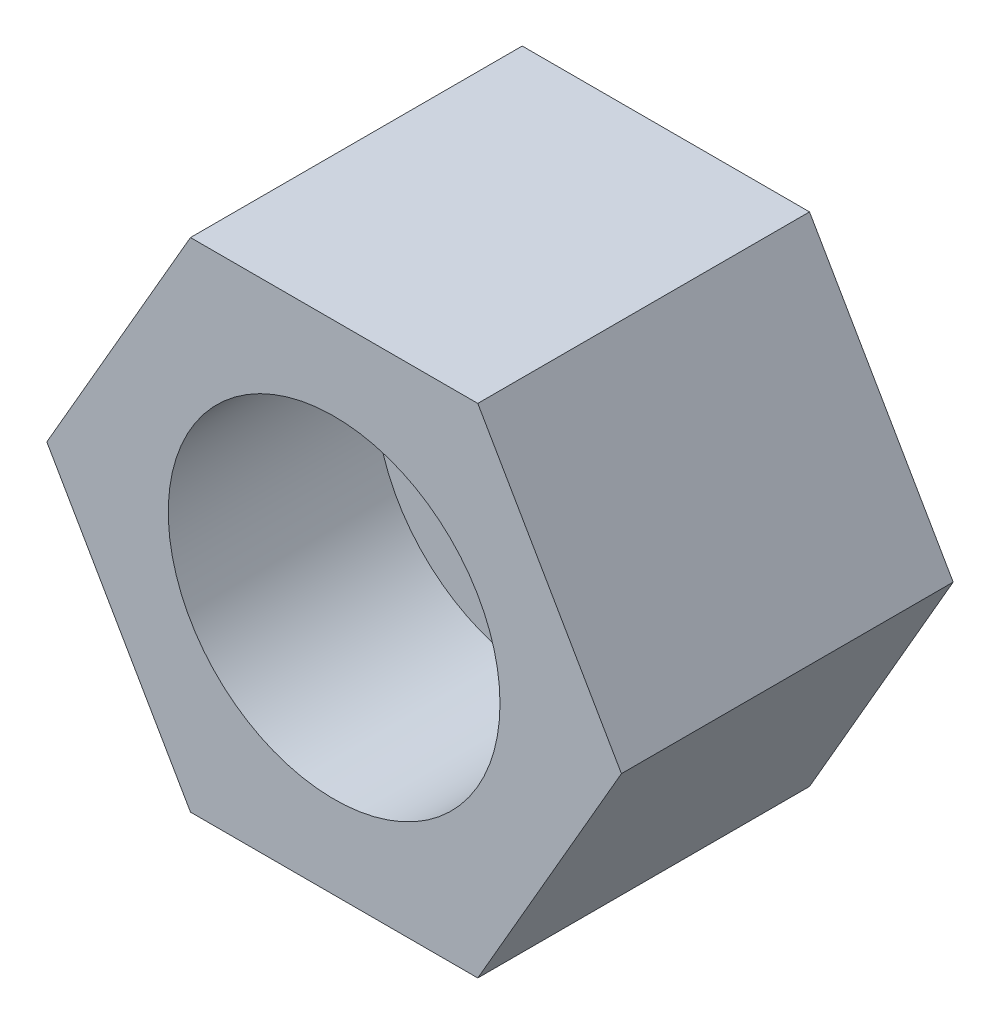
ISO-10303-21;
HEADER;
FILE_DESCRIPTION(('STEP AP214'),'2;1');
FILE_NAME('part.step','',(''),(''),'','','');
FILE_SCHEMA(('AUTOMOTIVE_DESIGN { 1 0 10303 214 1 1 1 1 }'));
ENDSEC;
DATA;
#1=APPLICATION_CONTEXT('core data for automotive mechanical design processes');
#2=APPLICATION_PROTOCOL_DEFINITION('international standard','automotive_design',2000,#1);
#3=PRODUCT_CONTEXT('',#1,'mechanical');
#4=PRODUCT('Part','Part','',(#3));
#5=PRODUCT_RELATED_PRODUCT_CATEGORY('part','',(#4));
#6=PRODUCT_DEFINITION_FORMATION('','',#4);
#7=PRODUCT_DEFINITION_CONTEXT('part definition',#1,'design');
#8=PRODUCT_DEFINITION('design','',#6,#7);
#9=PRODUCT_DEFINITION_SHAPE('','',#8);
#10=(LENGTH_UNIT() NAMED_UNIT(*) SI_UNIT(.MILLI.,.METRE.));
#11=(NAMED_UNIT(*) PLANE_ANGLE_UNIT() SI_UNIT($,.RADIAN.));
#12=(NAMED_UNIT(*) SI_UNIT($,.STERADIAN.) SOLID_ANGLE_UNIT());
#13=UNCERTAINTY_MEASURE_WITH_UNIT(LENGTH_MEASURE(1.E-05),#10,'distance_accuracy_value','');
#14=(GEOMETRIC_REPRESENTATION_CONTEXT(3) GLOBAL_UNCERTAINTY_ASSIGNED_CONTEXT((#13)) GLOBAL_UNIT_ASSIGNED_CONTEXT((#10,
#11,#12)) REPRESENTATION_CONTEXT('',''));
#15=CARTESIAN_POINT('',(0.,0.,0.));
#16=DIRECTION('',(0.,0.,1.));
#17=DIRECTION('',(1.,0.,0.));
#18=AXIS2_PLACEMENT_3D('',#15,#16,#17);
#19=CARTESIAN_POINT('',(0.,0.,4.));
#20=DIRECTION('',(0.,0.,-1.));
#21=DIRECTION('',(-1.,0.,0.));
#22=AXIS2_PLACEMENT_3D('',#19,#20,#21);
#23=CYLINDRICAL_SURFACE('',#22,2.);
#24=CARTESIAN_POINT('',(0.,0.,-4.));
#25=DIRECTION('',(0.,0.,1.));
#26=DIRECTION('',(1.,0.,0.));
#27=AXIS2_PLACEMENT_3D('',#24,#25,#26);
#28=CIRCLE('',#27,2.);
#29=CARTESIAN_POINT('',(2.,0.,-4.));
#30=VERTEX_POINT('',#29);
#31=EDGE_CURVE('E127',#30,#30,#28,.T.);
#32=ORIENTED_EDGE('',*,*,#31,.F.);
#33=EDGE_LOOP('',(#32));
#34=FACE_BOUND('',#33,.T.);
#35=CARTESIAN_POINT('',(0.,0.,-1.));
#36=DIRECTION('',(0.,0.,1.));
#37=DIRECTION('',(1.,0.,0.));
#38=AXIS2_PLACEMENT_3D('',#35,#36,#37);
#39=CIRCLE('',#38,2.);
#40=CARTESIAN_POINT('',(2.,0.,-1.));
#41=VERTEX_POINT('',#40);
#42=EDGE_CURVE('E41',#41,#41,#39,.T.);
#43=ORIENTED_EDGE('',*,*,#42,.T.);
#44=EDGE_LOOP('',(#43));
#45=FACE_BOUND('',#44,.T.);
#46=ADVANCED_FACE('F37',(#34,#45),#23,.F.);
#47=CARTESIAN_POINT('',(0.,0.,4.));
#48=DIRECTION('',(0.,0.,1.));
#49=DIRECTION('',(1.,0.,0.));
#50=AXIS2_PLACEMENT_3D('',#47,#48,#49);
#51=PLANE('',#50);
#52=CARTESIAN_POINT('',(0.,0.,4.));
#53=DIRECTION('',(0.,0.,1.));
#54=DIRECTION('',(1.,0.,0.));
#55=AXIS2_PLACEMENT_3D('',#52,#53,#54);
#56=CIRCLE('',#55,4.);
#57=CARTESIAN_POINT('',(4.,0.,4.));
#58=VERTEX_POINT('',#57);
#59=EDGE_CURVE('E239',#58,#58,#56,.T.);
#60=ORIENTED_EDGE('',*,*,#59,.F.);
#61=EDGE_LOOP('',(#60));
#62=FACE_BOUND('',#61,.T.);
#63=DIRECTION('',(0.499999999999995,0.866025403784442,0.));
#64=VECTOR('',#63,1.);
#65=CARTESIAN_POINT('',(3.46410161513783,-5.99999999999996,4.));
#66=LINE('',#65,#64);
#67=CARTESIAN_POINT('',(3.46410161513783,-5.99999999999996,4.));
#68=VERTEX_POINT('',#67);
#69=CARTESIAN_POINT('',(6.92820323027551,0.,4.));
#70=VERTEX_POINT('',#69);
#71=EDGE_CURVE('E134',#68,#70,#66,.T.);
#72=ORIENTED_EDGE('',*,*,#71,.T.);
#73=DIRECTION('',(-0.500000000000001,0.866025403784438,0.));
#74=VECTOR('',#73,1.);
#75=CARTESIAN_POINT('',(6.92820323027551,0.,4.));
#76=LINE('',#75,#74);
#77=CARTESIAN_POINT('',(3.46410161513774,6.00000000000001,4.));
#78=VERTEX_POINT('',#77);
#79=EDGE_CURVE('E92',#70,#78,#76,.T.);
#80=ORIENTED_EDGE('',*,*,#79,.T.);
#81=DIRECTION('',(-1.,0.,0.));
#82=VECTOR('',#81,1.);
#83=CARTESIAN_POINT('',(3.46410161513774,6.00000000000001,4.));
#84=LINE('',#83,#82);
#85=CARTESIAN_POINT('',(-3.46410161513778,5.99999999999999,4.));
#86=VERTEX_POINT('',#85);
#87=EDGE_CURVE('E105',#78,#86,#84,.T.);
#88=ORIENTED_EDGE('',*,*,#87,.T.);
#89=DIRECTION('',(-0.499999999999995,-0.866025403784442,0.));
#90=VECTOR('',#89,1.);
#91=CARTESIAN_POINT('',(-3.46410161513778,5.99999999999999,4.));
#92=LINE('',#91,#90);
#93=CARTESIAN_POINT('',(-6.92820323027551,0.,4.));
#94=VERTEX_POINT('',#93);
#95=EDGE_CURVE('E99',#86,#94,#92,.T.);
#96=ORIENTED_EDGE('',*,*,#95,.T.);
#97=DIRECTION('',(0.500000000000007,-0.866025403784435,0.));
#98=VECTOR('',#97,1.);
#99=CARTESIAN_POINT('',(-6.92820323027551,0.,4.));
#100=LINE('',#99,#98);
#101=CARTESIAN_POINT('',(-3.4641016151377,-6.00000000000004,4.));
#102=VERTEX_POINT('',#101);
#103=EDGE_CURVE('E103',#94,#102,#100,.T.);
#104=ORIENTED_EDGE('',*,*,#103,.T.);
#105=DIRECTION('',(1.,0.,0.));
#106=VECTOR('',#105,1.);
#107=CARTESIAN_POINT('',(-3.4641016151377,-6.00000000000004,4.));
#108=LINE('',#107,#106);
#109=EDGE_CURVE('E55',#102,#68,#108,.T.);
#110=ORIENTED_EDGE('',*,*,#109,.T.);
#111=EDGE_LOOP('',(#72,#80,#88,#96,#104,#110));
#112=FACE_BOUND('',#111,.T.);
#113=ADVANCED_FACE('F101',(#62,#112),#51,.T.);
#114=CARTESIAN_POINT('',(0.,0.,-4.));
#115=DIRECTION('',(0.,0.,1.));
#116=DIRECTION('',(1.,0.,0.));
#117=AXIS2_PLACEMENT_3D('',#114,#115,#116);
#118=PLANE('',#117);
#119=DIRECTION('',(0.499999999999995,0.866025403784442,0.));
#120=VECTOR('',#119,1.);
#121=CARTESIAN_POINT('',(3.46410161513783,-5.99999999999996,-4.));
#122=LINE('',#121,#120);
#123=CARTESIAN_POINT('',(3.46410161513783,-5.99999999999996,-4.));
#124=VERTEX_POINT('',#123);
#125=CARTESIAN_POINT('',(6.92820323027551,0.,-4.));
#126=VERTEX_POINT('',#125);
#127=EDGE_CURVE('E123',#124,#126,#122,.T.);
#128=ORIENTED_EDGE('',*,*,#127,.F.);
#129=DIRECTION('',(1.,0.,0.));
#130=VECTOR('',#129,1.);
#131=CARTESIAN_POINT('',(-3.4641016151377,-6.00000000000004,-4.));
#132=LINE('',#131,#130);
#133=CARTESIAN_POINT('',(-3.4641016151377,-6.00000000000004,-4.));
#134=VERTEX_POINT('',#133);
#135=EDGE_CURVE('E84',#134,#124,#132,.T.);
#136=ORIENTED_EDGE('',*,*,#135,.F.);
#137=DIRECTION('',(0.500000000000007,-0.866025403784435,0.));
#138=VECTOR('',#137,1.);
#139=CARTESIAN_POINT('',(-6.92820323027551,0.,-4.));
#140=LINE('',#139,#138);
#141=CARTESIAN_POINT('',(-6.92820323027551,0.,-4.));
#142=VERTEX_POINT('',#141);
#143=EDGE_CURVE('E78',#142,#134,#140,.T.);
#144=ORIENTED_EDGE('',*,*,#143,.F.);
#145=DIRECTION('',(-0.499999999999995,-0.866025403784442,0.));
#146=VECTOR('',#145,1.);
#147=CARTESIAN_POINT('',(-3.46410161513778,5.99999999999999,-4.));
#148=LINE('',#147,#146);
#149=CARTESIAN_POINT('',(-3.46410161513778,5.99999999999999,-4.));
#150=VERTEX_POINT('',#149);
#151=EDGE_CURVE('E113',#150,#142,#148,.T.);
#152=ORIENTED_EDGE('',*,*,#151,.F.);
#153=DIRECTION('',(-1.,0.,0.));
#154=VECTOR('',#153,1.);
#155=CARTESIAN_POINT('',(3.46410161513774,6.00000000000001,-4.));
#156=LINE('',#155,#154);
#157=CARTESIAN_POINT('',(3.46410161513774,6.00000000000001,-4.));
#158=VERTEX_POINT('',#157);
#159=EDGE_CURVE('E129',#158,#150,#156,.T.);
#160=ORIENTED_EDGE('',*,*,#159,.F.);
#161=DIRECTION('',(-0.500000000000001,0.866025403784438,0.));
#162=VECTOR('',#161,1.);
#163=CARTESIAN_POINT('',(6.92820323027551,0.,-4.));
#164=LINE('',#163,#162);
#165=EDGE_CURVE('E126',#126,#158,#164,.T.);
#166=ORIENTED_EDGE('',*,*,#165,.F.);
#167=EDGE_LOOP('',(#128,#136,#144,#152,#160,#166));
#168=FACE_BOUND('',#167,.T.);
#169=ORIENTED_EDGE('',*,*,#31,.T.);
#170=EDGE_LOOP('',(#169));
#171=FACE_BOUND('',#170,.T.);
#172=ADVANCED_FACE('F144',(#168,#171),#118,.F.);
#173=CARTESIAN_POINT('',(3.46410161513783,-5.99999999999996,4.));
#174=DIRECTION('',(-0.866025403784442,0.499999999999995,0.));
#175=DIRECTION('',(-0.499999999999995,-0.866025403784442,0.));
#176=AXIS2_PLACEMENT_3D('',#173,#174,#175);
#177=PLANE('',#176);
#178=ORIENTED_EDGE('',*,*,#127,.T.);
#179=DIRECTION('',(0.,0.,-1.));
#180=VECTOR('',#179,1.);
#181=CARTESIAN_POINT('',(6.92820323027551,0.,4.));
#182=LINE('',#181,#180);
#183=EDGE_CURVE('E11',#70,#126,#182,.T.);
#184=ORIENTED_EDGE('',*,*,#183,.F.);
#185=ORIENTED_EDGE('',*,*,#71,.F.);
#186=DIRECTION('',(0.,0.,-1.));
#187=VECTOR('',#186,1.);
#188=CARTESIAN_POINT('',(3.46410161513783,-5.99999999999996,4.));
#189=LINE('',#188,#187);
#190=EDGE_CURVE('E119',#68,#124,#189,.T.);
#191=ORIENTED_EDGE('',*,*,#190,.T.);
#192=EDGE_LOOP('',(#178,#184,#185,#191));
#193=FACE_BOUND('',#192,.T.);
#194=ADVANCED_FACE('F39',(#193),#177,.F.);
#195=CARTESIAN_POINT('',(6.92820323027551,0.,4.));
#196=DIRECTION('',(-0.866025403784438,-0.500000000000001,0.));
#197=DIRECTION('',(0.500000000000001,-0.866025403784438,0.));
#198=AXIS2_PLACEMENT_3D('',#195,#196,#197);
#199=PLANE('',#198);
#200=ORIENTED_EDGE('',*,*,#165,.T.);
#201=DIRECTION('',(0.,0.,-1.));
#202=VECTOR('',#201,1.);
#203=CARTESIAN_POINT('',(3.46410161513774,6.00000000000001,4.));
#204=LINE('',#203,#202);
#205=EDGE_CURVE('E47',#78,#158,#204,.T.);
#206=ORIENTED_EDGE('',*,*,#205,.F.);
#207=ORIENTED_EDGE('',*,*,#79,.F.);
#208=ORIENTED_EDGE('',*,*,#183,.T.);
#209=EDGE_LOOP('',(#200,#206,#207,#208));
#210=FACE_BOUND('',#209,.T.);
#211=ADVANCED_FACE('F177',(#210),#199,.F.);
#212=CARTESIAN_POINT('',(3.46410161513774,6.00000000000001,4.));
#213=DIRECTION('',(0.,-1.,0.));
#214=DIRECTION('',(1.,0.,0.));
#215=AXIS2_PLACEMENT_3D('',#212,#213,#214);
#216=PLANE('',#215);
#217=ORIENTED_EDGE('',*,*,#159,.T.);
#218=DIRECTION('',(0.,0.,-1.));
#219=VECTOR('',#218,1.);
#220=CARTESIAN_POINT('',(-3.46410161513778,5.99999999999999,4.));
#221=LINE('',#220,#219);
#222=EDGE_CURVE('E114',#86,#150,#221,.T.);
#223=ORIENTED_EDGE('',*,*,#222,.F.);
#224=ORIENTED_EDGE('',*,*,#87,.F.);
#225=ORIENTED_EDGE('',*,*,#205,.T.);
#226=EDGE_LOOP('',(#217,#223,#224,#225));
#227=FACE_BOUND('',#226,.T.);
#228=ADVANCED_FACE('F141',(#227),#216,.F.);
#229=CARTESIAN_POINT('',(-3.46410161513778,5.99999999999999,4.));
#230=DIRECTION('',(0.866025403784442,-0.499999999999995,0.));
#231=DIRECTION('',(0.499999999999995,0.866025403784442,0.));
#232=AXIS2_PLACEMENT_3D('',#229,#230,#231);
#233=PLANE('',#232);
#234=ORIENTED_EDGE('',*,*,#151,.T.);
#235=DIRECTION('',(0.,0.,-1.));
#236=VECTOR('',#235,1.);
#237=CARTESIAN_POINT('',(-6.92820323027551,0.,4.));
#238=LINE('',#237,#236);
#239=EDGE_CURVE('E110',#94,#142,#238,.T.);
#240=ORIENTED_EDGE('',*,*,#239,.F.);
#241=ORIENTED_EDGE('',*,*,#95,.F.);
#242=ORIENTED_EDGE('',*,*,#222,.T.);
#243=EDGE_LOOP('',(#234,#240,#241,#242));
#244=FACE_BOUND('',#243,.T.);
#245=ADVANCED_FACE('F111',(#244),#233,.F.);
#246=CARTESIAN_POINT('',(-6.92820323027551,0.,4.));
#247=DIRECTION('',(0.866025403784435,0.500000000000007,0.));
#248=DIRECTION('',(-0.500000000000007,0.866025403784435,0.));
#249=AXIS2_PLACEMENT_3D('',#246,#247,#248);
#250=PLANE('',#249);
#251=ORIENTED_EDGE('',*,*,#143,.T.);
#252=DIRECTION('',(0.,0.,-1.));
#253=VECTOR('',#252,1.);
#254=CARTESIAN_POINT('',(-3.4641016151377,-6.00000000000004,4.));
#255=LINE('',#254,#253);
#256=EDGE_CURVE('E115',#102,#134,#255,.T.);
#257=ORIENTED_EDGE('',*,*,#256,.F.);
#258=ORIENTED_EDGE('',*,*,#103,.F.);
#259=ORIENTED_EDGE('',*,*,#239,.T.);
#260=EDGE_LOOP('',(#251,#257,#258,#259));
#261=FACE_BOUND('',#260,.T.);
#262=ADVANCED_FACE('F117',(#261),#250,.F.);
#263=CARTESIAN_POINT('',(-3.4641016151377,-6.00000000000004,4.));
#264=DIRECTION('',(0.,1.,0.));
#265=DIRECTION('',(-1.,0.,0.));
#266=AXIS2_PLACEMENT_3D('',#263,#264,#265);
#267=PLANE('',#266);
#268=ORIENTED_EDGE('',*,*,#135,.T.);
#269=ORIENTED_EDGE('',*,*,#190,.F.);
#270=ORIENTED_EDGE('',*,*,#109,.F.);
#271=ORIENTED_EDGE('',*,*,#256,.T.);
#272=EDGE_LOOP('',(#268,#269,#270,#271));
#273=FACE_BOUND('',#272,.T.);
#274=ADVANCED_FACE('F149',(#273),#267,.F.);
#275=CARTESIAN_POINT('',(0.,0.,-1.));
#276=DIRECTION('',(0.,0.,1.));
#277=DIRECTION('',(1.,0.,0.));
#278=AXIS2_PLACEMENT_3D('',#275,#276,#277);
#279=CYLINDRICAL_SURFACE('',#278,4.);
#280=CARTESIAN_POINT('',(0.,0.,-1.));
#281=DIRECTION('',(0.,0.,1.));
#282=DIRECTION('',(1.,0.,0.));
#283=AXIS2_PLACEMENT_3D('',#280,#281,#282);
#284=CIRCLE('',#283,4.);
#285=CARTESIAN_POINT('',(4.,0.,-1.));
#286=VERTEX_POINT('',#285);
#287=EDGE_CURVE('E238',#286,#286,#284,.T.);
#288=ORIENTED_EDGE('',*,*,#287,.F.);
#289=EDGE_LOOP('',(#288));
#290=FACE_BOUND('',#289,.T.);
#291=ORIENTED_EDGE('',*,*,#59,.T.);
#292=EDGE_LOOP('',(#291));
#293=FACE_BOUND('',#292,.T.);
#294=ADVANCED_FACE('F151',(#290,#293),#279,.F.);
#295=CARTESIAN_POINT('',(0.,0.,-1.));
#296=DIRECTION('',(0.,0.,1.));
#297=DIRECTION('',(1.,0.,0.));
#298=AXIS2_PLACEMENT_3D('',#295,#296,#297);
#299=PLANE('',#298);
#300=ORIENTED_EDGE('',*,*,#42,.F.);
#301=EDGE_LOOP('',(#300));
#302=FACE_BOUND('',#301,.T.);
#303=ORIENTED_EDGE('',*,*,#287,.T.);
#304=EDGE_LOOP('',(#303));
#305=FACE_BOUND('',#304,.T.);
#306=ADVANCED_FACE('F157',(#302,#305),#299,.T.);
#307=CLOSED_SHELL('',(#46,#113,#172,#194,#211,#228,#245,#262,#274,#294,#306));
#308=MANIFOLD_SOLID_BREP('B2',#307);
#309=ADVANCED_BREP_SHAPE_REPRESENTATION('',(#18,#308),#14);
#310=SHAPE_DEFINITION_REPRESENTATION(#9,#309);
ENDSEC;
END-ISO-10303-21;
